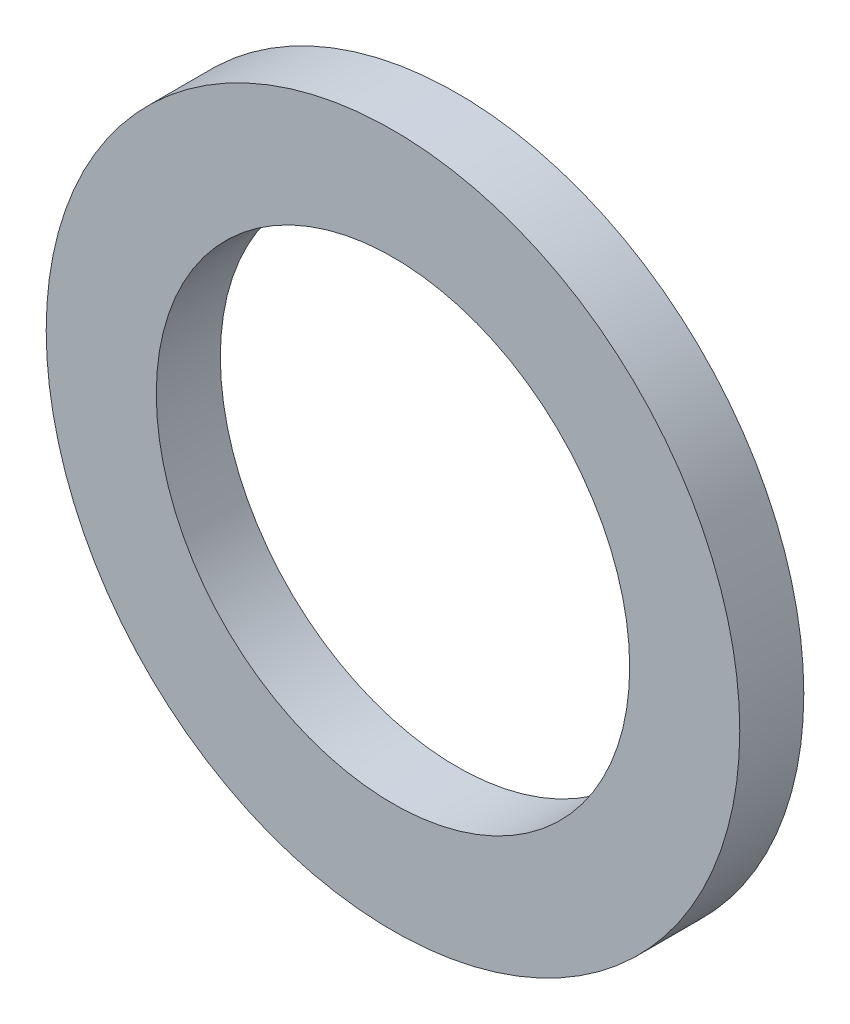
ISO-10303-21;
HEADER;
FILE_DESCRIPTION(('STEP AP214'),'2;1');
FILE_NAME('part.step','',(''),(''),'','','');
FILE_SCHEMA(('AUTOMOTIVE_DESIGN { 1 0 10303 214 1 1 1 1 }'));
ENDSEC;
DATA;
#1=APPLICATION_CONTEXT('core data for automotive mechanical design processes');
#2=APPLICATION_PROTOCOL_DEFINITION('international standard','automotive_design',2000,#1);
#3=PRODUCT_CONTEXT('',#1,'mechanical');
#4=PRODUCT('Part','Part','',(#3));
#5=PRODUCT_RELATED_PRODUCT_CATEGORY('part','',(#4));
#6=PRODUCT_DEFINITION_FORMATION('','',#4);
#7=PRODUCT_DEFINITION_CONTEXT('part definition',#1,'design');
#8=PRODUCT_DEFINITION('design','',#6,#7);
#9=PRODUCT_DEFINITION_SHAPE('','',#8);
#10=(LENGTH_UNIT() NAMED_UNIT(*) SI_UNIT(.MILLI.,.METRE.));
#11=(NAMED_UNIT(*) PLANE_ANGLE_UNIT() SI_UNIT($,.RADIAN.));
#12=(NAMED_UNIT(*) SI_UNIT($,.STERADIAN.) SOLID_ANGLE_UNIT());
#13=UNCERTAINTY_MEASURE_WITH_UNIT(LENGTH_MEASURE(1.E-05),#10,'distance_accuracy_value','');
#14=(GEOMETRIC_REPRESENTATION_CONTEXT(3) GLOBAL_UNCERTAINTY_ASSIGNED_CONTEXT((#13)) GLOBAL_UNIT_ASSIGNED_CONTEXT((#10,
#11,#12)) REPRESENTATION_CONTEXT('',''));
#15=CARTESIAN_POINT('',(0.,0.,0.));
#16=DIRECTION('',(0.,0.,1.));
#17=DIRECTION('',(1.,0.,0.));
#18=AXIS2_PLACEMENT_3D('',#15,#16,#17);
#19=CARTESIAN_POINT('',(0.,5.73351648351648,2.375));
#20=DIRECTION('',(0.,0.,-1.));
#21=DIRECTION('',(-1.,0.,0.));
#22=AXIS2_PLACEMENT_3D('',#19,#20,#21);
#23=PLANE('',#22);
#24=CARTESIAN_POINT('',(0.,0.,2.375));
#25=DIRECTION('',(0.,0.,1.));
#26=DIRECTION('',(1.,0.,0.));
#27=AXIS2_PLACEMENT_3D('',#24,#25,#26);
#28=CIRCLE('',#27,4.3);
#29=CARTESIAN_POINT('',(4.3,0.,2.375));
#30=VERTEX_POINT('',#29);
#31=EDGE_CURVE('E27',#30,#30,#28,.F.);
#32=ORIENTED_EDGE('',*,*,#31,.T.);
#33=EDGE_LOOP('',(#32));
#34=FACE_BOUND('',#33,.T.);
#35=CARTESIAN_POINT('',(0.,0.,2.375));
#36=DIRECTION('',(0.,0.,1.));
#37=DIRECTION('',(1.,0.,0.));
#38=AXIS2_PLACEMENT_3D('',#35,#36,#37);
#39=CIRCLE('',#38,6.3);
#40=CARTESIAN_POINT('',(6.3,0.,2.375));
#41=VERTEX_POINT('',#40);
#42=EDGE_CURVE('E18',#41,#41,#39,.F.);
#43=ORIENTED_EDGE('',*,*,#42,.F.);
#44=EDGE_LOOP('',(#43));
#45=FACE_BOUND('',#44,.T.);
#46=ADVANCED_FACE('F15',(#34,#45),#23,.F.);
#47=CARTESIAN_POINT('',(0.,0.,2.5));
#48=DIRECTION('',(0.,0.,1.));
#49=DIRECTION('',(1.,0.,0.));
#50=AXIS2_PLACEMENT_3D('',#47,#48,#49);
#51=CYLINDRICAL_SURFACE('',#50,6.3);
#52=CARTESIAN_POINT('',(0.,0.,1.21175743903915));
#53=DIRECTION('',(0.,0.,1.));
#54=DIRECTION('',(1.,0.,0.));
#55=AXIS2_PLACEMENT_3D('',#52,#53,#54);
#56=CIRCLE('',#55,6.3);
#57=CARTESIAN_POINT('',(6.3,0.,1.21175743903915));
#58=VERTEX_POINT('',#57);
#59=EDGE_CURVE('E22',#58,#58,#56,.T.);
#60=ORIENTED_EDGE('',*,*,#59,.T.);
#61=EDGE_LOOP('',(#60));
#62=FACE_BOUND('',#61,.T.);
#63=ORIENTED_EDGE('',*,*,#42,.T.);
#64=EDGE_LOOP('',(#63));
#65=FACE_BOUND('',#64,.T.);
#66=ADVANCED_FACE('F35',(#62,#65),#51,.T.);
#67=CARTESIAN_POINT('',(0.,0.,2.5));
#68=DIRECTION('',(0.,0.,1.));
#69=DIRECTION('',(1.,0.,0.));
#70=AXIS2_PLACEMENT_3D('',#67,#68,#69);
#71=CYLINDRICAL_SURFACE('',#70,4.3);
#72=ORIENTED_EDGE('',*,*,#31,.F.);
#73=EDGE_LOOP('',(#72));
#74=FACE_BOUND('',#73,.T.);
#75=CARTESIAN_POINT('',(0.,0.,1.21175743903915));
#76=DIRECTION('',(0.,0.,1.));
#77=DIRECTION('',(1.,0.,0.));
#78=AXIS2_PLACEMENT_3D('',#75,#76,#77);
#79=CIRCLE('',#78,4.3);
#80=CARTESIAN_POINT('',(4.3,0.,1.21175743903915));
#81=VERTEX_POINT('',#80);
#82=EDGE_CURVE('E10',#81,#81,#79,.F.);
#83=ORIENTED_EDGE('',*,*,#82,.T.);
#84=EDGE_LOOP('',(#83));
#85=FACE_BOUND('',#84,.T.);
#86=ADVANCED_FACE('F42',(#74,#85),#71,.F.);
#87=CARTESIAN_POINT('',(0.,5.73351648351648,1.21175743903915));
#88=DIRECTION('',(0.,0.,1.));
#89=DIRECTION('',(1.,0.,0.));
#90=AXIS2_PLACEMENT_3D('',#87,#88,#89);
#91=PLANE('',#90);
#92=ORIENTED_EDGE('',*,*,#82,.F.);
#93=EDGE_LOOP('',(#92));
#94=FACE_BOUND('',#93,.T.);
#95=ORIENTED_EDGE('',*,*,#59,.F.);
#96=EDGE_LOOP('',(#95));
#97=FACE_BOUND('',#96,.T.);
#98=ADVANCED_FACE('F44',(#94,#97),#91,.F.);
#99=CLOSED_SHELL('',(#46,#66,#86,#98));
#100=MANIFOLD_SOLID_BREP('B1',#99);
#101=ADVANCED_BREP_SHAPE_REPRESENTATION('',(#18,#100),#14);
#102=SHAPE_DEFINITION_REPRESENTATION(#9,#101);
ENDSEC;
END-ISO-10303-21;
